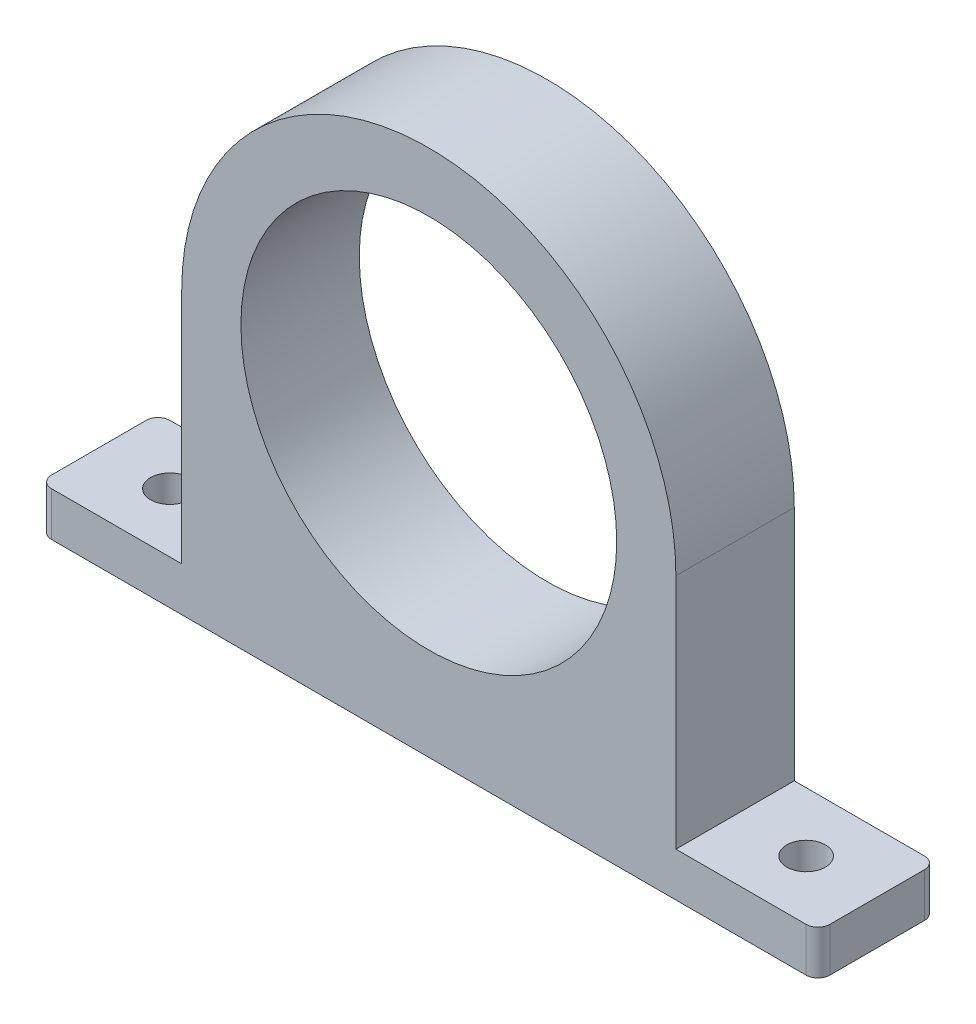
ISO-10303-21;
HEADER;
FILE_DESCRIPTION(('STEP AP214'),'2;1');
FILE_NAME('part.step','',(''),(''),'','','');
FILE_SCHEMA(('AUTOMOTIVE_DESIGN { 1 0 10303 214 1 1 1 1 }'));
ENDSEC;
DATA;
#1=APPLICATION_CONTEXT('core data for automotive mechanical design processes');
#2=APPLICATION_PROTOCOL_DEFINITION('international standard','automotive_design',2000,#1);
#3=PRODUCT_CONTEXT('',#1,'mechanical');
#4=PRODUCT('Part','Part','',(#3));
#5=PRODUCT_RELATED_PRODUCT_CATEGORY('part','',(#4));
#6=PRODUCT_DEFINITION_FORMATION('','',#4);
#7=PRODUCT_DEFINITION_CONTEXT('part definition',#1,'design');
#8=PRODUCT_DEFINITION('design','',#6,#7);
#9=PRODUCT_DEFINITION_SHAPE('','',#8);
#10=(LENGTH_UNIT() NAMED_UNIT(*) SI_UNIT(.MILLI.,.METRE.));
#11=(NAMED_UNIT(*) PLANE_ANGLE_UNIT() SI_UNIT($,.RADIAN.));
#12=(NAMED_UNIT(*) SI_UNIT($,.STERADIAN.) SOLID_ANGLE_UNIT());
#13=UNCERTAINTY_MEASURE_WITH_UNIT(LENGTH_MEASURE(1.E-05),#10,'distance_accuracy_value','');
#14=(GEOMETRIC_REPRESENTATION_CONTEXT(3) GLOBAL_UNCERTAINTY_ASSIGNED_CONTEXT((#13)) GLOBAL_UNIT_ASSIGNED_CONTEXT((#10,
#11,#12)) REPRESENTATION_CONTEXT('',''));
#15=CARTESIAN_POINT('',(0.,0.,0.));
#16=DIRECTION('',(0.,0.,1.));
#17=DIRECTION('',(1.,0.,0.));
#18=AXIS2_PLACEMENT_3D('',#15,#16,#17);
#19=CARTESIAN_POINT('',(32.875,-20.,10.));
#20=DIRECTION('',(0.,-1.,0.));
#21=DIRECTION('',(1.,0.,0.));
#22=AXIS2_PLACEMENT_3D('',#19,#20,#21);
#23=PLANE('',#22);
#24=DIRECTION('',(0.,0.,-1.));
#25=VECTOR('',#24,1.);
#26=CARTESIAN_POINT('',(32.875,-20.,10.));
#27=LINE('',#26,#25);
#28=CARTESIAN_POINT('',(32.875,-20.,9.));
#29=VERTEX_POINT('',#28);
#30=CARTESIAN_POINT('',(32.875,-20.,0.999999999999999));
#31=VERTEX_POINT('',#30);
#32=EDGE_CURVE('E201',#29,#31,#27,.T.);
#33=ORIENTED_EDGE('',*,*,#32,.T.);
#34=CARTESIAN_POINT('',(31.875,-20.,0.999999999999999));
#35=DIRECTION('',(0.,-1.,0.));
#36=DIRECTION('',(1.,0.,0.));
#37=AXIS2_PLACEMENT_3D('',#34,#35,#36);
#38=CIRCLE('',#37,1.);
#39=CARTESIAN_POINT('',(31.875,-20.,0.));
#40=VERTEX_POINT('',#39);
#41=EDGE_CURVE('E161',#31,#40,#38,.F.);
#42=ORIENTED_EDGE('',*,*,#41,.T.);
#43=DIRECTION('',(-1.,0.,0.));
#44=VECTOR('',#43,1.);
#45=CARTESIAN_POINT('',(32.875,-20.,0.));
#46=LINE('',#45,#44);
#47=CARTESIAN_POINT('',(20.875,-20.,0.));
#48=VERTEX_POINT('',#47);
#49=EDGE_CURVE('E212',#40,#48,#46,.T.);
#50=ORIENTED_EDGE('',*,*,#49,.T.);
#51=DIRECTION('',(0.,0.,-1.));
#52=VECTOR('',#51,1.);
#53=CARTESIAN_POINT('',(20.875,-20.,10.));
#54=LINE('',#53,#52);
#55=CARTESIAN_POINT('',(20.875,-20.,10.));
#56=VERTEX_POINT('',#55);
#57=EDGE_CURVE('E206',#56,#48,#54,.T.);
#58=ORIENTED_EDGE('',*,*,#57,.F.);
#59=DIRECTION('',(-1.,0.,0.));
#60=VECTOR('',#59,1.);
#61=CARTESIAN_POINT('',(32.875,-20.,10.));
#62=LINE('',#61,#60);
#63=CARTESIAN_POINT('',(31.875,-20.,10.));
#64=VERTEX_POINT('',#63);
#65=EDGE_CURVE('E223',#64,#56,#62,.T.);
#66=ORIENTED_EDGE('',*,*,#65,.F.);
#67=CARTESIAN_POINT('',(31.875,-20.,9.));
#68=DIRECTION('',(0.,-1.,0.));
#69=DIRECTION('',(1.,0.,0.));
#70=AXIS2_PLACEMENT_3D('',#67,#68,#69);
#71=CIRCLE('',#70,1.);
#72=EDGE_CURVE('E159',#64,#29,#71,.F.);
#73=ORIENTED_EDGE('',*,*,#72,.T.);
#74=EDGE_LOOP('',(#33,#42,#50,#58,#66,#73));
#75=FACE_BOUND('',#74,.T.);
#76=CARTESIAN_POINT('',(26.875,-20.,5.));
#77=DIRECTION('',(0.,1.,0.));
#78=DIRECTION('',(0.,0.,1.));
#79=AXIS2_PLACEMENT_3D('',#76,#77,#78);
#80=CIRCLE('',#79,1.63195);
#81=CARTESIAN_POINT('',(26.875,-20.,6.63195));
#82=VERTEX_POINT('',#81);
#83=EDGE_CURVE('E234',#82,#82,#80,.T.);
#84=ORIENTED_EDGE('',*,*,#83,.F.);
#85=EDGE_LOOP('',(#84));
#86=FACE_BOUND('',#85,.T.);
#87=ADVANCED_FACE('F32',(#75,#86),#23,.F.);
#88=CARTESIAN_POINT('',(0.,0.,10.));
#89=DIRECTION('',(0.,0.,1.));
#90=DIRECTION('',(1.,0.,0.));
#91=AXIS2_PLACEMENT_3D('',#88,#89,#90);
#92=PLANE('',#91);
#93=DIRECTION('',(1.,0.,0.));
#94=VECTOR('',#93,1.);
#95=CARTESIAN_POINT('',(-32.875,-23.72,10.));
#96=LINE('',#95,#94);
#97=CARTESIAN_POINT('',(-31.875,-23.72,10.));
#98=VERTEX_POINT('',#97);
#99=CARTESIAN_POINT('',(31.875,-23.72,10.));
#100=VERTEX_POINT('',#99);
#101=EDGE_CURVE('E189',#98,#100,#96,.T.);
#102=ORIENTED_EDGE('',*,*,#101,.T.);
#103=DIRECTION('',(0.,1.,0.));
#104=VECTOR('',#103,1.);
#105=CARTESIAN_POINT('',(31.875,-20.,10.));
#106=LINE('',#105,#104);
#107=EDGE_CURVE('E178',#100,#64,#106,.T.);
#108=ORIENTED_EDGE('',*,*,#107,.T.);
#109=ORIENTED_EDGE('',*,*,#65,.T.);
#110=DIRECTION('',(0.,1.,0.));
#111=VECTOR('',#110,1.);
#112=CARTESIAN_POINT('',(20.875,-20.,10.));
#113=LINE('',#112,#111);
#114=CARTESIAN_POINT('',(20.875,0.,10.));
#115=VERTEX_POINT('',#114);
#116=EDGE_CURVE('E140',#56,#115,#113,.T.);
#117=ORIENTED_EDGE('',*,*,#116,.T.);
#118=CARTESIAN_POINT('',(0.,0.,10.));
#119=DIRECTION('',(0.,0.,1.));
#120=DIRECTION('',(1.,0.,0.));
#121=AXIS2_PLACEMENT_3D('',#118,#119,#120);
#122=CIRCLE('',#121,20.875);
#123=CARTESIAN_POINT('',(-20.875,0.,10.));
#124=VERTEX_POINT('',#123);
#125=EDGE_CURVE('E133',#115,#124,#122,.T.);
#126=ORIENTED_EDGE('',*,*,#125,.T.);
#127=DIRECTION('',(0.,-1.,0.));
#128=VECTOR('',#127,1.);
#129=CARTESIAN_POINT('',(-20.875,0.,10.));
#130=LINE('',#129,#128);
#131=CARTESIAN_POINT('',(-20.875,-20.,10.));
#132=VERTEX_POINT('',#131);
#133=EDGE_CURVE('E121',#124,#132,#130,.T.);
#134=ORIENTED_EDGE('',*,*,#133,.T.);
#135=DIRECTION('',(-1.,0.,0.));
#136=VECTOR('',#135,1.);
#137=CARTESIAN_POINT('',(-20.875,-20.,10.));
#138=LINE('',#137,#136);
#139=CARTESIAN_POINT('',(-31.875,-20.,10.));
#140=VERTEX_POINT('',#139);
#141=EDGE_CURVE('E132',#132,#140,#138,.T.);
#142=ORIENTED_EDGE('',*,*,#141,.T.);
#143=DIRECTION('',(0.,-1.,0.));
#144=VECTOR('',#143,1.);
#145=CARTESIAN_POINT('',(-31.875,-23.72,10.));
#146=LINE('',#145,#144);
#147=EDGE_CURVE('E175',#140,#98,#146,.T.);
#148=ORIENTED_EDGE('',*,*,#147,.T.);
#149=EDGE_LOOP('',(#102,#108,#109,#117,#126,#134,#142,#148));
#150=FACE_BOUND('',#149,.T.);
#151=CARTESIAN_POINT('',(0.,0.,10.));
#152=DIRECTION('',(0.,0.,1.));
#153=DIRECTION('',(1.,0.,0.));
#154=AXIS2_PLACEMENT_3D('',#151,#152,#153);
#155=CIRCLE('',#154,15.875);
#156=CARTESIAN_POINT('',(15.875,0.,10.));
#157=VERTEX_POINT('',#156);
#158=EDGE_CURVE('E221',#157,#157,#155,.T.);
#159=ORIENTED_EDGE('',*,*,#158,.F.);
#160=EDGE_LOOP('',(#159));
#161=FACE_BOUND('',#160,.T.);
#162=ADVANCED_FACE('F137',(#150,#161),#92,.T.);
#163=CARTESIAN_POINT('',(0.,0.,0.));
#164=DIRECTION('',(0.,0.,1.));
#165=DIRECTION('',(1.,0.,0.));
#166=AXIS2_PLACEMENT_3D('',#163,#164,#165);
#167=PLANE('',#166);
#168=ORIENTED_EDGE('',*,*,#49,.F.);
#169=DIRECTION('',(0.,1.,0.));
#170=VECTOR('',#169,1.);
#171=CARTESIAN_POINT('',(31.875,0.,0.));
#172=LINE('',#171,#170);
#173=CARTESIAN_POINT('',(31.875,-23.72,0.));
#174=VERTEX_POINT('',#173);
#175=EDGE_CURVE('E165',#40,#174,#172,.F.);
#176=ORIENTED_EDGE('',*,*,#175,.T.);
#177=DIRECTION('',(1.,0.,0.));
#178=VECTOR('',#177,1.);
#179=CARTESIAN_POINT('',(-32.875,-23.72,0.));
#180=LINE('',#179,#178);
#181=CARTESIAN_POINT('',(-31.875,-23.72,0.));
#182=VERTEX_POINT('',#181);
#183=EDGE_CURVE('E214',#182,#174,#180,.T.);
#184=ORIENTED_EDGE('',*,*,#183,.F.);
#185=DIRECTION('',(0.,-1.,0.));
#186=VECTOR('',#185,1.);
#187=CARTESIAN_POINT('',(-31.875,0.,0.));
#188=LINE('',#187,#186);
#189=CARTESIAN_POINT('',(-31.875,-20.,0.));
#190=VERTEX_POINT('',#189);
#191=EDGE_CURVE('E163',#182,#190,#188,.F.);
#192=ORIENTED_EDGE('',*,*,#191,.T.);
#193=DIRECTION('',(-1.,0.,0.));
#194=VECTOR('',#193,1.);
#195=CARTESIAN_POINT('',(-20.875,-20.,0.));
#196=LINE('',#195,#194);
#197=CARTESIAN_POINT('',(-20.875,-20.,0.));
#198=VERTEX_POINT('',#197);
#199=EDGE_CURVE('E216',#198,#190,#196,.T.);
#200=ORIENTED_EDGE('',*,*,#199,.F.);
#201=DIRECTION('',(0.,-1.,0.));
#202=VECTOR('',#201,1.);
#203=CARTESIAN_POINT('',(-20.875,0.,0.));
#204=LINE('',#203,#202);
#205=CARTESIAN_POINT('',(-20.875,0.,0.));
#206=VERTEX_POINT('',#205);
#207=EDGE_CURVE('E218',#206,#198,#204,.T.);
#208=ORIENTED_EDGE('',*,*,#207,.F.);
#209=CARTESIAN_POINT('',(0.,0.,0.));
#210=DIRECTION('',(0.,0.,1.));
#211=DIRECTION('',(1.,0.,0.));
#212=AXIS2_PLACEMENT_3D('',#209,#210,#211);
#213=CIRCLE('',#212,20.875);
#214=CARTESIAN_POINT('',(20.875,0.,0.));
#215=VERTEX_POINT('',#214);
#216=EDGE_CURVE('E148',#215,#206,#213,.T.);
#217=ORIENTED_EDGE('',*,*,#216,.F.);
#218=DIRECTION('',(0.,1.,0.));
#219=VECTOR('',#218,1.);
#220=CARTESIAN_POINT('',(20.875,-20.,0.));
#221=LINE('',#220,#219);
#222=EDGE_CURVE('E144',#48,#215,#221,.T.);
#223=ORIENTED_EDGE('',*,*,#222,.F.);
#224=EDGE_LOOP('',(#168,#176,#184,#192,#200,#208,#217,#223));
#225=FACE_BOUND('',#224,.T.);
#226=CARTESIAN_POINT('',(0.,0.,0.));
#227=DIRECTION('',(0.,0.,1.));
#228=DIRECTION('',(1.,0.,0.));
#229=AXIS2_PLACEMENT_3D('',#226,#227,#228);
#230=CIRCLE('',#229,15.875);
#231=CARTESIAN_POINT('',(15.875,0.,0.));
#232=VERTEX_POINT('',#231);
#233=EDGE_CURVE('E226',#232,#232,#230,.T.);
#234=ORIENTED_EDGE('',*,*,#233,.T.);
#235=EDGE_LOOP('',(#234));
#236=FACE_BOUND('',#235,.T.);
#237=ADVANCED_FACE('F260',(#225,#236),#167,.F.);
#238=CARTESIAN_POINT('',(0.,0.,10.));
#239=DIRECTION('',(0.,0.,-1.));
#240=DIRECTION('',(-1.,0.,0.));
#241=AXIS2_PLACEMENT_3D('',#238,#239,#240);
#242=CYLINDRICAL_SURFACE('',#241,20.875);
#243=ORIENTED_EDGE('',*,*,#216,.T.);
#244=DIRECTION('',(0.,0.,-1.));
#245=VECTOR('',#244,1.);
#246=CARTESIAN_POINT('',(-20.875,0.,10.));
#247=LINE('',#246,#245);
#248=EDGE_CURVE('E125',#124,#206,#247,.T.);
#249=ORIENTED_EDGE('',*,*,#248,.F.);
#250=ORIENTED_EDGE('',*,*,#125,.F.);
#251=DIRECTION('',(0.,0.,-1.));
#252=VECTOR('',#251,1.);
#253=CARTESIAN_POINT('',(20.875,0.,10.));
#254=LINE('',#253,#252);
#255=EDGE_CURVE('E209',#115,#215,#254,.T.);
#256=ORIENTED_EDGE('',*,*,#255,.T.);
#257=EDGE_LOOP('',(#243,#249,#250,#256));
#258=FACE_BOUND('',#257,.T.);
#259=ADVANCED_FACE('F146',(#258),#242,.T.);
#260=CARTESIAN_POINT('',(-20.875,0.,10.));
#261=DIRECTION('',(1.,0.,0.));
#262=DIRECTION('',(0.,1.,0.));
#263=AXIS2_PLACEMENT_3D('',#260,#261,#262);
#264=PLANE('',#263);
#265=ORIENTED_EDGE('',*,*,#207,.T.);
#266=DIRECTION('',(0.,0.,-1.));
#267=VECTOR('',#266,1.);
#268=CARTESIAN_POINT('',(-20.875,-20.,10.));
#269=LINE('',#268,#267);
#270=EDGE_CURVE('E128',#132,#198,#269,.T.);
#271=ORIENTED_EDGE('',*,*,#270,.F.);
#272=ORIENTED_EDGE('',*,*,#133,.F.);
#273=ORIENTED_EDGE('',*,*,#248,.T.);
#274=EDGE_LOOP('',(#265,#271,#272,#273));
#275=FACE_BOUND('',#274,.T.);
#276=ADVANCED_FACE('F123',(#275),#264,.F.);
#277=CARTESIAN_POINT('',(-20.875,-20.,10.));
#278=DIRECTION('',(0.,-1.,0.));
#279=DIRECTION('',(1.,0.,0.));
#280=AXIS2_PLACEMENT_3D('',#277,#278,#279);
#281=PLANE('',#280);
#282=CARTESIAN_POINT('',(-26.875,-20.,5.));
#283=DIRECTION('',(0.,1.,0.));
#284=DIRECTION('',(0.,0.,1.));
#285=AXIS2_PLACEMENT_3D('',#282,#283,#284);
#286=CIRCLE('',#285,1.63195);
#287=CARTESIAN_POINT('',(-26.875,-20.,6.63195));
#288=VERTEX_POINT('',#287);
#289=EDGE_CURVE('E240',#288,#288,#286,.T.);
#290=ORIENTED_EDGE('',*,*,#289,.F.);
#291=EDGE_LOOP('',(#290));
#292=FACE_BOUND('',#291,.T.);
#293=ORIENTED_EDGE('',*,*,#199,.T.);
#294=CARTESIAN_POINT('',(-31.875,-20.,0.999999999999999));
#295=DIRECTION('',(0.,-1.,0.));
#296=DIRECTION('',(1.,0.,0.));
#297=AXIS2_PLACEMENT_3D('',#294,#295,#296);
#298=CIRCLE('',#297,1.);
#299=CARTESIAN_POINT('',(-32.875,-20.,0.999999999999999));
#300=VERTEX_POINT('',#299);
#301=EDGE_CURVE('E11',#190,#300,#298,.F.);
#302=ORIENTED_EDGE('',*,*,#301,.T.);
#303=DIRECTION('',(0.,0.,-1.));
#304=VECTOR('',#303,1.);
#305=CARTESIAN_POINT('',(-32.875,-20.,10.));
#306=LINE('',#305,#304);
#307=CARTESIAN_POINT('',(-32.875,-20.,9.));
#308=VERTEX_POINT('',#307);
#309=EDGE_CURVE('E153',#308,#300,#306,.T.);
#310=ORIENTED_EDGE('',*,*,#309,.F.);
#311=CARTESIAN_POINT('',(-31.875,-20.,9.));
#312=DIRECTION('',(0.,-1.,0.));
#313=DIRECTION('',(1.,0.,0.));
#314=AXIS2_PLACEMENT_3D('',#311,#312,#313);
#315=CIRCLE('',#314,1.);
#316=EDGE_CURVE('E40',#308,#140,#315,.F.);
#317=ORIENTED_EDGE('',*,*,#316,.T.);
#318=ORIENTED_EDGE('',*,*,#141,.F.);
#319=ORIENTED_EDGE('',*,*,#270,.T.);
#320=EDGE_LOOP('',(#293,#302,#310,#317,#318,#319));
#321=FACE_BOUND('',#320,.T.);
#322=ADVANCED_FACE('F185',(#292,#321),#281,.F.);
#323=CARTESIAN_POINT('',(-32.875,-20.,10.));
#324=DIRECTION('',(1.,0.,0.));
#325=DIRECTION('',(0.,0.,-1.));
#326=AXIS2_PLACEMENT_3D('',#323,#324,#325);
#327=PLANE('',#326);
#328=ORIENTED_EDGE('',*,*,#309,.T.);
#329=DIRECTION('',(0.,-1.,0.));
#330=VECTOR('',#329,1.);
#331=CARTESIAN_POINT('',(-32.875,-20.,0.999999999999999));
#332=LINE('',#331,#330);
#333=CARTESIAN_POINT('',(-32.875,-23.72,0.999999999999999));
#334=VERTEX_POINT('',#333);
#335=EDGE_CURVE('E182',#300,#334,#332,.T.);
#336=ORIENTED_EDGE('',*,*,#335,.T.);
#337=DIRECTION('',(0.,0.,-1.));
#338=VECTOR('',#337,1.);
#339=CARTESIAN_POINT('',(-32.875,-23.72,10.));
#340=LINE('',#339,#338);
#341=CARTESIAN_POINT('',(-32.875,-23.72,9.));
#342=VERTEX_POINT('',#341);
#343=EDGE_CURVE('E195',#342,#334,#340,.T.);
#344=ORIENTED_EDGE('',*,*,#343,.F.);
#345=DIRECTION('',(0.,-1.,0.));
#346=VECTOR('',#345,1.);
#347=CARTESIAN_POINT('',(-32.875,-20.,9.));
#348=LINE('',#347,#346);
#349=EDGE_CURVE('E52',#342,#308,#348,.F.);
#350=ORIENTED_EDGE('',*,*,#349,.T.);
#351=EDGE_LOOP('',(#328,#336,#344,#350));
#352=FACE_BOUND('',#351,.T.);
#353=ADVANCED_FACE('F196',(#352),#327,.F.);
#354=CARTESIAN_POINT('',(-32.875,-23.72,10.));
#355=DIRECTION('',(0.,1.,0.));
#356=DIRECTION('',(0.,0.,1.));
#357=AXIS2_PLACEMENT_3D('',#354,#355,#356);
#358=PLANE('',#357);
#359=CARTESIAN_POINT('',(-26.875,-23.72,5.));
#360=DIRECTION('',(0.,1.,0.));
#361=DIRECTION('',(0.,0.,1.));
#362=AXIS2_PLACEMENT_3D('',#359,#360,#361);
#363=CIRCLE('',#362,1.63195);
#364=CARTESIAN_POINT('',(-26.875,-23.72,6.63195));
#365=VERTEX_POINT('',#364);
#366=EDGE_CURVE('E237',#365,#365,#363,.T.);
#367=ORIENTED_EDGE('',*,*,#366,.T.);
#368=EDGE_LOOP('',(#367));
#369=FACE_BOUND('',#368,.T.);
#370=CARTESIAN_POINT('',(26.875,-23.72,5.));
#371=DIRECTION('',(0.,1.,0.));
#372=DIRECTION('',(0.,0.,1.));
#373=AXIS2_PLACEMENT_3D('',#370,#371,#372);
#374=CIRCLE('',#373,1.63195);
#375=CARTESIAN_POINT('',(26.875,-23.72,6.63195));
#376=VERTEX_POINT('',#375);
#377=EDGE_CURVE('E229',#376,#376,#374,.T.);
#378=ORIENTED_EDGE('',*,*,#377,.T.);
#379=EDGE_LOOP('',(#378));
#380=FACE_BOUND('',#379,.T.);
#381=ORIENTED_EDGE('',*,*,#183,.T.);
#382=CARTESIAN_POINT('',(31.875,-23.72,0.999999999999999));
#383=DIRECTION('',(0.,1.,0.));
#384=DIRECTION('',(0.,0.,1.));
#385=AXIS2_PLACEMENT_3D('',#382,#383,#384);
#386=CIRCLE('',#385,1.);
#387=CARTESIAN_POINT('',(32.875,-23.72,0.999999999999999));
#388=VERTEX_POINT('',#387);
#389=EDGE_CURVE('E173',#174,#388,#386,.F.);
#390=ORIENTED_EDGE('',*,*,#389,.T.);
#391=DIRECTION('',(0.,0.,-1.));
#392=VECTOR('',#391,1.);
#393=CARTESIAN_POINT('',(32.875,-23.72,10.));
#394=LINE('',#393,#392);
#395=CARTESIAN_POINT('',(32.875,-23.72,9.));
#396=VERTEX_POINT('',#395);
#397=EDGE_CURVE('E198',#396,#388,#394,.T.);
#398=ORIENTED_EDGE('',*,*,#397,.F.);
#399=CARTESIAN_POINT('',(31.875,-23.72,9.));
#400=DIRECTION('',(0.,1.,0.));
#401=DIRECTION('',(0.,0.,1.));
#402=AXIS2_PLACEMENT_3D('',#399,#400,#401);
#403=CIRCLE('',#402,1.);
#404=EDGE_CURVE('E171',#396,#100,#403,.F.);
#405=ORIENTED_EDGE('',*,*,#404,.T.);
#406=ORIENTED_EDGE('',*,*,#101,.F.);
#407=CARTESIAN_POINT('',(-31.875,-23.72,9.));
#408=DIRECTION('',(0.,1.,0.));
#409=DIRECTION('',(0.,0.,1.));
#410=AXIS2_PLACEMENT_3D('',#407,#408,#409);
#411=CIRCLE('',#410,1.);
#412=EDGE_CURVE('E167',#98,#342,#411,.F.);
#413=ORIENTED_EDGE('',*,*,#412,.T.);
#414=ORIENTED_EDGE('',*,*,#343,.T.);
#415=CARTESIAN_POINT('',(-31.875,-23.72,0.999999999999999));
#416=DIRECTION('',(0.,1.,0.));
#417=DIRECTION('',(0.,0.,1.));
#418=AXIS2_PLACEMENT_3D('',#415,#416,#417);
#419=CIRCLE('',#418,1.);
#420=EDGE_CURVE('E169',#334,#182,#419,.F.);
#421=ORIENTED_EDGE('',*,*,#420,.T.);
#422=EDGE_LOOP('',(#381,#390,#398,#405,#406,#413,#414,#421));
#423=FACE_BOUND('',#422,.T.);
#424=ADVANCED_FACE('F194',(#369,#380,#423),#358,.F.);
#425=CARTESIAN_POINT('',(32.875,-23.72,10.));
#426=DIRECTION('',(-1.,0.,0.));
#427=DIRECTION('',(0.,0.,1.));
#428=AXIS2_PLACEMENT_3D('',#425,#426,#427);
#429=PLANE('',#428);
#430=ORIENTED_EDGE('',*,*,#397,.T.);
#431=DIRECTION('',(0.,1.,0.));
#432=VECTOR('',#431,1.);
#433=CARTESIAN_POINT('',(32.875,-23.72,0.999999999999999));
#434=LINE('',#433,#432);
#435=EDGE_CURVE('E151',#388,#31,#434,.T.);
#436=ORIENTED_EDGE('',*,*,#435,.T.);
#437=ORIENTED_EDGE('',*,*,#32,.F.);
#438=DIRECTION('',(0.,1.,0.));
#439=VECTOR('',#438,1.);
#440=CARTESIAN_POINT('',(32.875,-23.72,9.));
#441=LINE('',#440,#439);
#442=EDGE_CURVE('E149',#29,#396,#441,.F.);
#443=ORIENTED_EDGE('',*,*,#442,.T.);
#444=EDGE_LOOP('',(#430,#436,#437,#443));
#445=FACE_BOUND('',#444,.T.);
#446=ADVANCED_FACE('F267',(#445),#429,.F.);
#447=CARTESIAN_POINT('',(20.875,-20.,10.));
#448=DIRECTION('',(-1.,0.,0.));
#449=DIRECTION('',(0.,-1.,0.));
#450=AXIS2_PLACEMENT_3D('',#447,#448,#449);
#451=PLANE('',#450);
#452=ORIENTED_EDGE('',*,*,#222,.T.);
#453=ORIENTED_EDGE('',*,*,#255,.F.);
#454=ORIENTED_EDGE('',*,*,#116,.F.);
#455=ORIENTED_EDGE('',*,*,#57,.T.);
#456=EDGE_LOOP('',(#452,#453,#454,#455));
#457=FACE_BOUND('',#456,.T.);
#458=ADVANCED_FACE('F265',(#457),#451,.F.);
#459=CARTESIAN_POINT('',(0.,0.,10.));
#460=DIRECTION('',(0.,0.,-1.));
#461=DIRECTION('',(-1.,0.,0.));
#462=AXIS2_PLACEMENT_3D('',#459,#460,#461);
#463=CYLINDRICAL_SURFACE('',#462,15.875);
#464=ORIENTED_EDGE('',*,*,#158,.T.);
#465=EDGE_LOOP('',(#464));
#466=FACE_BOUND('',#465,.T.);
#467=ORIENTED_EDGE('',*,*,#233,.F.);
#468=EDGE_LOOP('',(#467));
#469=FACE_BOUND('',#468,.T.);
#470=ADVANCED_FACE('F292',(#466,#469),#463,.F.);
#471=CARTESIAN_POINT('',(31.875,-23.72,0.999999999999999));
#472=DIRECTION('',(0.,1.,0.));
#473=DIRECTION('',(0.,0.,1.));
#474=AXIS2_PLACEMENT_3D('',#471,#472,#473);
#475=CYLINDRICAL_SURFACE('',#474,1.);
#476=ORIENTED_EDGE('',*,*,#389,.F.);
#477=ORIENTED_EDGE('',*,*,#175,.F.);
#478=ORIENTED_EDGE('',*,*,#41,.F.);
#479=ORIENTED_EDGE('',*,*,#435,.F.);
#480=EDGE_LOOP('',(#476,#477,#478,#479));
#481=FACE_BOUND('',#480,.T.);
#482=ADVANCED_FACE('F294',(#481),#475,.T.);
#483=CARTESIAN_POINT('',(31.875,0.,9.));
#484=DIRECTION('',(0.,-1.,0.));
#485=DIRECTION('',(0.,0.,-1.));
#486=AXIS2_PLACEMENT_3D('',#483,#484,#485);
#487=CYLINDRICAL_SURFACE('',#486,1.);
#488=ORIENTED_EDGE('',*,*,#404,.F.);
#489=ORIENTED_EDGE('',*,*,#442,.F.);
#490=ORIENTED_EDGE('',*,*,#72,.F.);
#491=ORIENTED_EDGE('',*,*,#107,.F.);
#492=EDGE_LOOP('',(#488,#489,#490,#491));
#493=FACE_BOUND('',#492,.T.);
#494=ADVANCED_FACE('F318',(#493),#487,.T.);
#495=CARTESIAN_POINT('',(-31.875,-20.,0.999999999999999));
#496=DIRECTION('',(0.,-1.,0.));
#497=DIRECTION('',(0.,0.,-1.));
#498=AXIS2_PLACEMENT_3D('',#495,#496,#497);
#499=CYLINDRICAL_SURFACE('',#498,1.);
#500=ORIENTED_EDGE('',*,*,#301,.F.);
#501=ORIENTED_EDGE('',*,*,#191,.F.);
#502=ORIENTED_EDGE('',*,*,#420,.F.);
#503=ORIENTED_EDGE('',*,*,#335,.F.);
#504=EDGE_LOOP('',(#500,#501,#502,#503));
#505=FACE_BOUND('',#504,.T.);
#506=ADVANCED_FACE('F290',(#505),#499,.T.);
#507=CARTESIAN_POINT('',(-31.875,0.,9.));
#508=DIRECTION('',(0.,1.,0.));
#509=DIRECTION('',(0.,0.,1.));
#510=AXIS2_PLACEMENT_3D('',#507,#508,#509);
#511=CYLINDRICAL_SURFACE('',#510,1.);
#512=ORIENTED_EDGE('',*,*,#316,.F.);
#513=ORIENTED_EDGE('',*,*,#349,.F.);
#514=ORIENTED_EDGE('',*,*,#412,.F.);
#515=ORIENTED_EDGE('',*,*,#147,.F.);
#516=EDGE_LOOP('',(#512,#513,#514,#515));
#517=FACE_BOUND('',#516,.T.);
#518=ADVANCED_FACE('F34',(#517),#511,.T.);
#519=CARTESIAN_POINT('',(26.875,-20.,5.));
#520=DIRECTION('',(0.,1.,0.));
#521=DIRECTION('',(0.,0.,1.));
#522=AXIS2_PLACEMENT_3D('',#519,#520,#521);
#523=CYLINDRICAL_SURFACE('',#522,1.63195);
#524=ORIENTED_EDGE('',*,*,#377,.F.);
#525=EDGE_LOOP('',(#524));
#526=FACE_BOUND('',#525,.T.);
#527=ORIENTED_EDGE('',*,*,#83,.T.);
#528=EDGE_LOOP('',(#527));
#529=FACE_BOUND('',#528,.T.);
#530=ADVANCED_FACE('F279',(#526,#529),#523,.F.);
#531=CARTESIAN_POINT('',(-26.875,-20.,5.));
#532=DIRECTION('',(0.,1.,0.));
#533=DIRECTION('',(0.,0.,1.));
#534=AXIS2_PLACEMENT_3D('',#531,#532,#533);
#535=CYLINDRICAL_SURFACE('',#534,1.63195);
#536=ORIENTED_EDGE('',*,*,#366,.F.);
#537=EDGE_LOOP('',(#536));
#538=FACE_BOUND('',#537,.T.);
#539=ORIENTED_EDGE('',*,*,#289,.T.);
#540=EDGE_LOOP('',(#539));
#541=FACE_BOUND('',#540,.T.);
#542=ADVANCED_FACE('F244',(#538,#541),#535,.F.);
#543=CLOSED_SHELL('',(#87,#162,#237,#259,#276,#322,#353,#424,#446,#458,#470,#482,#494,#506,#518,
#530,#542));
#544=MANIFOLD_SOLID_BREP('B2',#543);
#545=ADVANCED_BREP_SHAPE_REPRESENTATION('',(#18,#544),#14);
#546=SHAPE_DEFINITION_REPRESENTATION(#9,#545);
ENDSEC;
END-ISO-10303-21;
